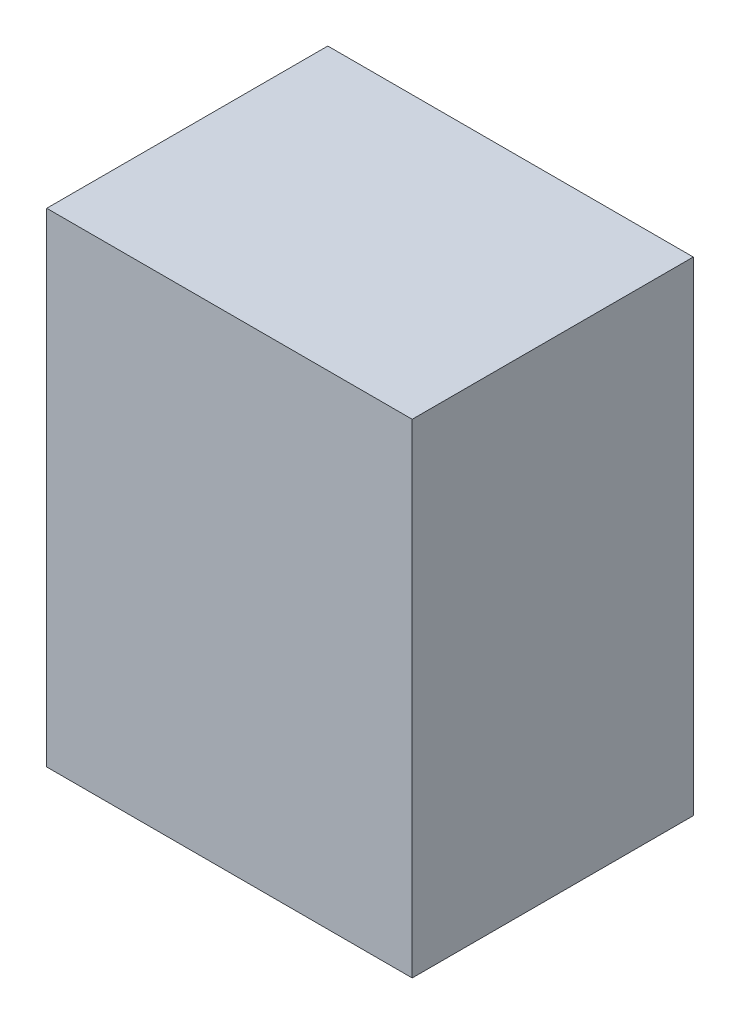
ISO-10303-21;
HEADER;
FILE_DESCRIPTION(('STEP AP214'),'2;1');
FILE_NAME('part.step','',(''),(''),'','','');
FILE_SCHEMA(('AUTOMOTIVE_DESIGN { 1 0 10303 214 1 1 1 1 }'));
ENDSEC;
DATA;
#1=APPLICATION_CONTEXT('core data for automotive mechanical design processes');
#2=APPLICATION_PROTOCOL_DEFINITION('international standard','automotive_design',2000,#1);
#3=PRODUCT_CONTEXT('',#1,'mechanical');
#4=PRODUCT('Part','Part','',(#3));
#5=PRODUCT_RELATED_PRODUCT_CATEGORY('part','',(#4));
#6=PRODUCT_DEFINITION_FORMATION('','',#4);
#7=PRODUCT_DEFINITION_CONTEXT('part definition',#1,'design');
#8=PRODUCT_DEFINITION('design','',#6,#7);
#9=PRODUCT_DEFINITION_SHAPE('','',#8);
#10=(LENGTH_UNIT() NAMED_UNIT(*) SI_UNIT(.MILLI.,.METRE.));
#11=(NAMED_UNIT(*) PLANE_ANGLE_UNIT() SI_UNIT($,.RADIAN.));
#12=(NAMED_UNIT(*) SI_UNIT($,.STERADIAN.) SOLID_ANGLE_UNIT());
#13=UNCERTAINTY_MEASURE_WITH_UNIT(LENGTH_MEASURE(1.E-05),#10,'distance_accuracy_value','');
#14=(GEOMETRIC_REPRESENTATION_CONTEXT(3) GLOBAL_UNCERTAINTY_ASSIGNED_CONTEXT((#13)) GLOBAL_UNIT_ASSIGNED_CONTEXT((#10,
#11,#12)) REPRESENTATION_CONTEXT('',''));
#15=CARTESIAN_POINT('',(0.,0.,0.));
#16=DIRECTION('',(0.,0.,1.));
#17=DIRECTION('',(1.,0.,0.));
#18=AXIS2_PLACEMENT_3D('',#15,#16,#17);
#19=CARTESIAN_POINT('',(-3.55000052,-4.70000076,5.45999924));
#20=DIRECTION('',(0.,0.,-1.));
#21=DIRECTION('',(-1.,0.,0.));
#22=AXIS2_PLACEMENT_3D('',#19,#20,#21);
#23=PLANE('',#22);
#24=DIRECTION('',(0.,1.,0.));
#25=VECTOR('',#24,1.);
#26=CARTESIAN_POINT('',(3.55000052,-4.70000076,5.45999924));
#27=LINE('',#26,#25);
#28=CARTESIAN_POINT('',(3.55000052,-4.70000076,5.45999924));
#29=VERTEX_POINT('',#28);
#30=CARTESIAN_POINT('',(3.55000052,4.70000076,5.45999924));
#31=VERTEX_POINT('',#30);
#32=EDGE_CURVE('E55',#29,#31,#27,.T.);
#33=ORIENTED_EDGE('',*,*,#32,.T.);
#34=DIRECTION('',(1.,0.,0.));
#35=VECTOR('',#34,1.);
#36=CARTESIAN_POINT('',(3.55000052,4.70000076,5.45999924));
#37=LINE('',#36,#35);
#38=CARTESIAN_POINT('',(-3.55000052,4.70000076,5.45999924));
#39=VERTEX_POINT('',#38);
#40=EDGE_CURVE('E57',#31,#39,#37,.F.);
#41=ORIENTED_EDGE('',*,*,#40,.T.);
#42=DIRECTION('',(0.,1.,0.));
#43=VECTOR('',#42,1.);
#44=CARTESIAN_POINT('',(-3.55000052,4.70000076,5.45999924));
#45=LINE('',#44,#43);
#46=CARTESIAN_POINT('',(-3.55000052,-4.70000076,5.45999924));
#47=VERTEX_POINT('',#46);
#48=EDGE_CURVE('E20',#39,#47,#45,.F.);
#49=ORIENTED_EDGE('',*,*,#48,.T.);
#50=DIRECTION('',(1.,0.,0.));
#51=VECTOR('',#50,1.);
#52=CARTESIAN_POINT('',(-3.55000052,-4.70000076,5.45999924));
#53=LINE('',#52,#51);
#54=EDGE_CURVE('E80',#47,#29,#53,.T.);
#55=ORIENTED_EDGE('',*,*,#54,.T.);
#56=EDGE_LOOP('',(#33,#41,#49,#55));
#57=FACE_BOUND('',#56,.T.);
#58=ADVANCED_FACE('F17',(#57),#23,.F.);
#59=CARTESIAN_POINT('',(-3.55000052,4.70000076,0.));
#60=DIRECTION('',(1.,0.,0.));
#61=DIRECTION('',(0.,0.,-1.));
#62=AXIS2_PLACEMENT_3D('',#59,#60,#61);
#63=PLANE('',#62);
#64=DIRECTION('',(0.,0.,1.));
#65=VECTOR('',#64,1.);
#66=CARTESIAN_POINT('',(-3.55000052,-4.70000076,0.));
#67=LINE('',#66,#65);
#68=CARTESIAN_POINT('',(-3.55000052,-4.70000076,0.));
#69=VERTEX_POINT('',#68);
#70=EDGE_CURVE('E68',#69,#47,#67,.T.);
#71=ORIENTED_EDGE('',*,*,#70,.T.);
#72=ORIENTED_EDGE('',*,*,#48,.F.);
#73=DIRECTION('',(0.,0.,-1.));
#74=VECTOR('',#73,1.);
#75=CARTESIAN_POINT('',(-3.55000052,4.70000076,0.));
#76=LINE('',#75,#74);
#77=CARTESIAN_POINT('',(-3.55000052,4.70000076,0.));
#78=VERTEX_POINT('',#77);
#79=EDGE_CURVE('E63',#39,#78,#76,.T.);
#80=ORIENTED_EDGE('',*,*,#79,.T.);
#81=DIRECTION('',(0.,1.,0.));
#82=VECTOR('',#81,1.);
#83=CARTESIAN_POINT('',(-3.55000052,-4.70000076,0.));
#84=LINE('',#83,#82);
#85=EDGE_CURVE('E83',#69,#78,#84,.T.);
#86=ORIENTED_EDGE('',*,*,#85,.F.);
#87=EDGE_LOOP('',(#71,#72,#80,#86));
#88=FACE_BOUND('',#87,.T.);
#89=ADVANCED_FACE('F65',(#88),#63,.F.);
#90=CARTESIAN_POINT('',(3.55000052,4.70000076,0.));
#91=DIRECTION('',(0.,-1.,0.));
#92=DIRECTION('',(0.,0.,-1.));
#93=AXIS2_PLACEMENT_3D('',#90,#91,#92);
#94=PLANE('',#93);
#95=ORIENTED_EDGE('',*,*,#79,.F.);
#96=ORIENTED_EDGE('',*,*,#40,.F.);
#97=DIRECTION('',(0.,0.,1.));
#98=VECTOR('',#97,1.);
#99=CARTESIAN_POINT('',(3.55000052,4.70000076,0.));
#100=LINE('',#99,#98);
#101=CARTESIAN_POINT('',(3.55000052,4.70000076,0.));
#102=VERTEX_POINT('',#101);
#103=EDGE_CURVE('E75',#31,#102,#100,.F.);
#104=ORIENTED_EDGE('',*,*,#103,.T.);
#105=DIRECTION('',(-1.,0.,0.));
#106=VECTOR('',#105,1.);
#107=CARTESIAN_POINT('',(-3.55000052,4.70000076,0.));
#108=LINE('',#107,#106);
#109=EDGE_CURVE('E72',#78,#102,#108,.F.);
#110=ORIENTED_EDGE('',*,*,#109,.F.);
#111=EDGE_LOOP('',(#95,#96,#104,#110));
#112=FACE_BOUND('',#111,.T.);
#113=ADVANCED_FACE('F70',(#112),#94,.F.);
#114=CARTESIAN_POINT('',(3.55000052,-4.70000076,0.));
#115=DIRECTION('',(-1.,0.,0.));
#116=DIRECTION('',(0.,0.,1.));
#117=AXIS2_PLACEMENT_3D('',#114,#115,#116);
#118=PLANE('',#117);
#119=ORIENTED_EDGE('',*,*,#103,.F.);
#120=ORIENTED_EDGE('',*,*,#32,.F.);
#121=DIRECTION('',(0.,0.,1.));
#122=VECTOR('',#121,1.);
#123=CARTESIAN_POINT('',(3.55000052,-4.70000076,0.));
#124=LINE('',#123,#122);
#125=CARTESIAN_POINT('',(3.55000052,-4.70000076,0.));
#126=VERTEX_POINT('',#125);
#127=EDGE_CURVE('E35',#29,#126,#124,.F.);
#128=ORIENTED_EDGE('',*,*,#127,.T.);
#129=DIRECTION('',(0.,1.,0.));
#130=VECTOR('',#129,1.);
#131=CARTESIAN_POINT('',(3.55000052,-4.70000076,0.));
#132=LINE('',#131,#130);
#133=EDGE_CURVE('E26',#102,#126,#132,.F.);
#134=ORIENTED_EDGE('',*,*,#133,.F.);
#135=EDGE_LOOP('',(#119,#120,#128,#134));
#136=FACE_BOUND('',#135,.T.);
#137=ADVANCED_FACE('F89',(#136),#118,.F.);
#138=CARTESIAN_POINT('',(-3.55000052,-4.70000076,0.));
#139=DIRECTION('',(0.,1.,0.));
#140=DIRECTION('',(0.,0.,1.));
#141=AXIS2_PLACEMENT_3D('',#138,#139,#140);
#142=PLANE('',#141);
#143=ORIENTED_EDGE('',*,*,#127,.F.);
#144=ORIENTED_EDGE('',*,*,#54,.F.);
#145=ORIENTED_EDGE('',*,*,#70,.F.);
#146=DIRECTION('',(-1.,0.,0.));
#147=VECTOR('',#146,1.);
#148=CARTESIAN_POINT('',(-3.55000052,-4.70000076,0.));
#149=LINE('',#148,#147);
#150=EDGE_CURVE('E11',#126,#69,#149,.T.);
#151=ORIENTED_EDGE('',*,*,#150,.F.);
#152=EDGE_LOOP('',(#143,#144,#145,#151));
#153=FACE_BOUND('',#152,.T.);
#154=ADVANCED_FACE('F91',(#153),#142,.F.);
#155=CARTESIAN_POINT('',(-3.55000052,-4.70000076,0.));
#156=DIRECTION('',(0.,0.,-1.));
#157=DIRECTION('',(-1.,0.,0.));
#158=AXIS2_PLACEMENT_3D('',#155,#156,#157);
#159=PLANE('',#158);
#160=ORIENTED_EDGE('',*,*,#133,.T.);
#161=ORIENTED_EDGE('',*,*,#150,.T.);
#162=ORIENTED_EDGE('',*,*,#85,.T.);
#163=ORIENTED_EDGE('',*,*,#109,.T.);
#164=EDGE_LOOP('',(#160,#161,#162,#163));
#165=FACE_BOUND('',#164,.T.);
#166=ADVANCED_FACE('F88',(#165),#159,.T.);
#167=CLOSED_SHELL('',(#58,#89,#113,#137,#154,#166));
#168=MANIFOLD_SOLID_BREP('B1',#167);
#169=ADVANCED_BREP_SHAPE_REPRESENTATION('',(#18,#168),#14);
#170=SHAPE_DEFINITION_REPRESENTATION(#9,#169);
ENDSEC;
END-ISO-10303-21;
